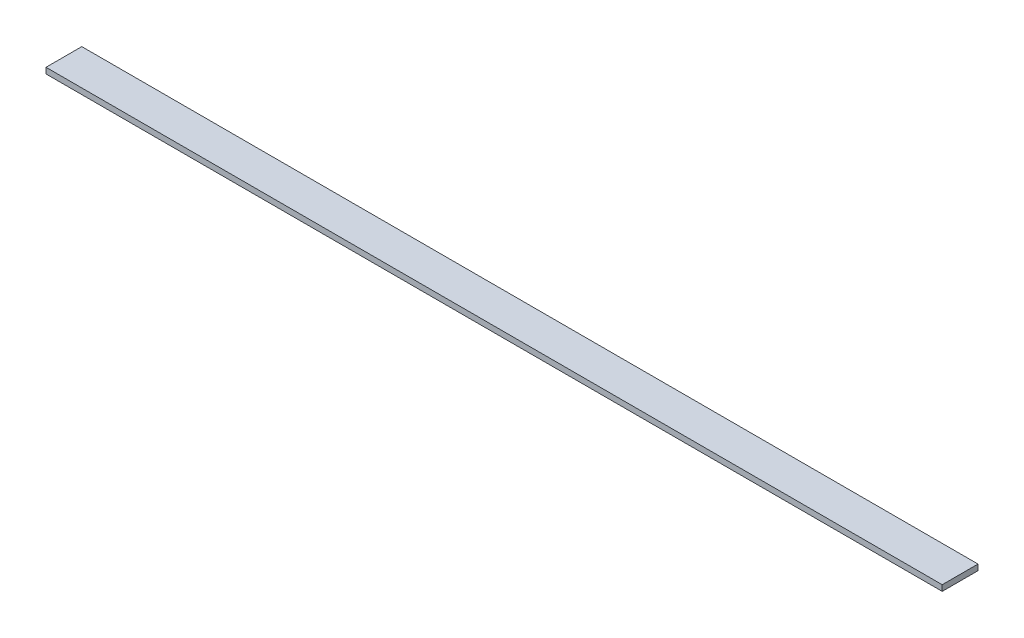
ISO-10303-21;
HEADER;
FILE_DESCRIPTION(('STEP AP214'),'2;1');
FILE_NAME('part.step','',(''),(''),'','','');
FILE_SCHEMA(('AUTOMOTIVE_DESIGN { 1 0 10303 214 1 1 1 1 }'));
ENDSEC;
DATA;
#1=APPLICATION_CONTEXT('core data for automotive mechanical design processes');
#2=APPLICATION_PROTOCOL_DEFINITION('international standard','automotive_design',2000,#1);
#3=PRODUCT_CONTEXT('',#1,'mechanical');
#4=PRODUCT('Part','Part','',(#3));
#5=PRODUCT_RELATED_PRODUCT_CATEGORY('part','',(#4));
#6=PRODUCT_DEFINITION_FORMATION('','',#4);
#7=PRODUCT_DEFINITION_CONTEXT('part definition',#1,'design');
#8=PRODUCT_DEFINITION('design','',#6,#7);
#9=PRODUCT_DEFINITION_SHAPE('','',#8);
#10=(LENGTH_UNIT() NAMED_UNIT(*) SI_UNIT(.MILLI.,.METRE.));
#11=(NAMED_UNIT(*) PLANE_ANGLE_UNIT() SI_UNIT($,.RADIAN.));
#12=(NAMED_UNIT(*) SI_UNIT($,.STERADIAN.) SOLID_ANGLE_UNIT());
#13=UNCERTAINTY_MEASURE_WITH_UNIT(LENGTH_MEASURE(1.E-05),#10,'distance_accuracy_value','');
#14=(GEOMETRIC_REPRESENTATION_CONTEXT(3) GLOBAL_UNCERTAINTY_ASSIGNED_CONTEXT((#13)) GLOBAL_UNIT_ASSIGNED_CONTEXT((#10,
#11,#12)) REPRESENTATION_CONTEXT('',''));
#15=CARTESIAN_POINT('',(0.,0.,0.));
#16=DIRECTION('',(0.,0.,1.));
#17=DIRECTION('',(1.,0.,0.));
#18=AXIS2_PLACEMENT_3D('',#15,#16,#17);
#19=CARTESIAN_POINT('',(-3811.4111111111,38.1,-1664.22916666666));
#20=DIRECTION('',(1.,0.,0.));
#21=DIRECTION('',(0.,0.,-0.999999999999999));
#22=AXIS2_PLACEMENT_3D('',#19,#20,#21);
#23=PLANE('',#22);
#24=DIRECTION('',(0.,0.,0.999999999999999));
#25=VECTOR('',#24,1.);
#26=CARTESIAN_POINT('',(-3811.4111111111,0.,-1664.22916666666));
#27=LINE('',#26,#25);
#28=CARTESIAN_POINT('',(-3811.4111111111,0.,-1664.22916666666));
#29=VERTEX_POINT('',#28);
#30=CARTESIAN_POINT('',(-3811.4111111111,0.,-1429.27916666666));
#31=VERTEX_POINT('',#30);
#32=EDGE_CURVE('E94',#29,#31,#27,.T.);
#33=ORIENTED_EDGE('',*,*,#32,.T.);
#34=DIRECTION('',(0.,-1.,0.));
#35=VECTOR('',#34,1.);
#36=CARTESIAN_POINT('',(-3811.4111111111,38.1,-1429.27916666666));
#37=LINE('',#36,#35);
#38=CARTESIAN_POINT('',(-3811.4111111111,38.1,-1429.27916666666));
#39=VERTEX_POINT('',#38);
#40=EDGE_CURVE('E11',#39,#31,#37,.T.);
#41=ORIENTED_EDGE('',*,*,#40,.F.);
#42=DIRECTION('',(0.,0.,0.999999999999999));
#43=VECTOR('',#42,1.);
#44=CARTESIAN_POINT('',(-3811.4111111111,38.1,-1664.22916666666));
#45=LINE('',#44,#43);
#46=CARTESIAN_POINT('',(-3811.4111111111,38.1,-1664.22916666666));
#47=VERTEX_POINT('',#46);
#48=EDGE_CURVE('E82',#47,#39,#45,.T.);
#49=ORIENTED_EDGE('',*,*,#48,.F.);
#50=DIRECTION('',(0.,-1.,0.));
#51=VECTOR('',#50,1.);
#52=CARTESIAN_POINT('',(-3811.4111111111,38.1,-1664.22916666666));
#53=LINE('',#52,#51);
#54=EDGE_CURVE('E90',#47,#29,#53,.T.);
#55=ORIENTED_EDGE('',*,*,#54,.T.);
#56=EDGE_LOOP('',(#33,#41,#49,#55));
#57=FACE_BOUND('',#56,.T.);
#58=ADVANCED_FACE('F31',(#57),#23,.F.);
#59=CARTESIAN_POINT('',(-3811.4111111111,38.1,-1429.27916666666));
#60=DIRECTION('',(0.,0.,-0.999999999999999));
#61=DIRECTION('',(-1.,0.,0.));
#62=AXIS2_PLACEMENT_3D('',#59,#60,#61);
#63=PLANE('',#62);
#64=DIRECTION('',(1.,0.,0.));
#65=VECTOR('',#64,1.);
#66=CARTESIAN_POINT('',(-3811.4111111111,0.,-1429.27916666666));
#67=LINE('',#66,#65);
#68=CARTESIAN_POINT('',(2071.8638888889,0.,-1429.27916666666));
#69=VERTEX_POINT('',#68);
#70=EDGE_CURVE('E86',#31,#69,#67,.T.);
#71=ORIENTED_EDGE('',*,*,#70,.T.);
#72=DIRECTION('',(0.,-1.,0.));
#73=VECTOR('',#72,1.);
#74=CARTESIAN_POINT('',(2071.8638888889,38.1,-1429.27916666666));
#75=LINE('',#74,#73);
#76=CARTESIAN_POINT('',(2071.8638888889,38.1,-1429.27916666666));
#77=VERTEX_POINT('',#76);
#78=EDGE_CURVE('E39',#77,#69,#75,.T.);
#79=ORIENTED_EDGE('',*,*,#78,.F.);
#80=DIRECTION('',(1.,0.,0.));
#81=VECTOR('',#80,1.);
#82=CARTESIAN_POINT('',(-3811.4111111111,38.1,-1429.27916666666));
#83=LINE('',#82,#81);
#84=EDGE_CURVE('E77',#39,#77,#83,.T.);
#85=ORIENTED_EDGE('',*,*,#84,.F.);
#86=ORIENTED_EDGE('',*,*,#40,.T.);
#87=EDGE_LOOP('',(#71,#79,#85,#86));
#88=FACE_BOUND('',#87,.T.);
#89=ADVANCED_FACE('F85',(#88),#63,.F.);
#90=CARTESIAN_POINT('',(2071.8638888889,38.1,-1664.22916666666));
#91=DIRECTION('',(-1.,0.,0.));
#92=DIRECTION('',(0.,0.,0.999999999999999));
#93=AXIS2_PLACEMENT_3D('',#90,#91,#92);
#94=PLANE('',#93);
#95=DIRECTION('',(0.,0.,-0.999999999999999));
#96=VECTOR('',#95,1.);
#97=CARTESIAN_POINT('',(2071.8638888889,0.,-1664.22916666666));
#98=LINE('',#97,#96);
#99=CARTESIAN_POINT('',(2071.8638888889,0.,-1664.22916666666));
#100=VERTEX_POINT('',#99);
#101=EDGE_CURVE('E64',#69,#100,#98,.T.);
#102=ORIENTED_EDGE('',*,*,#101,.T.);
#103=DIRECTION('',(0.,-1.,0.));
#104=VECTOR('',#103,1.);
#105=CARTESIAN_POINT('',(2071.8638888889,38.1,-1664.22916666666));
#106=LINE('',#105,#104);
#107=CARTESIAN_POINT('',(2071.8638888889,38.1,-1664.22916666666));
#108=VERTEX_POINT('',#107);
#109=EDGE_CURVE('E87',#108,#100,#106,.T.);
#110=ORIENTED_EDGE('',*,*,#109,.F.);
#111=DIRECTION('',(0.,0.,-0.999999999999999));
#112=VECTOR('',#111,1.);
#113=CARTESIAN_POINT('',(2071.8638888889,38.1,-1664.22916666666));
#114=LINE('',#113,#112);
#115=EDGE_CURVE('E80',#77,#108,#114,.T.);
#116=ORIENTED_EDGE('',*,*,#115,.F.);
#117=ORIENTED_EDGE('',*,*,#78,.T.);
#118=EDGE_LOOP('',(#102,#110,#116,#117));
#119=FACE_BOUND('',#118,.T.);
#120=ADVANCED_FACE('F88',(#119),#94,.F.);
#121=CARTESIAN_POINT('',(-3811.4111111111,38.1,-1664.22916666666));
#122=DIRECTION('',(0.,0.,0.999999999999999));
#123=DIRECTION('',(1.,0.,0.));
#124=AXIS2_PLACEMENT_3D('',#121,#122,#123);
#125=PLANE('',#124);
#126=DIRECTION('',(-1.,0.,0.));
#127=VECTOR('',#126,1.);
#128=CARTESIAN_POINT('',(-3811.4111111111,0.,-1664.22916666666));
#129=LINE('',#128,#127);
#130=EDGE_CURVE('E70',#100,#29,#129,.T.);
#131=ORIENTED_EDGE('',*,*,#130,.T.);
#132=ORIENTED_EDGE('',*,*,#54,.F.);
#133=DIRECTION('',(-1.,0.,0.));
#134=VECTOR('',#133,1.);
#135=CARTESIAN_POINT('',(-3811.4111111111,38.1,-1664.22916666666));
#136=LINE('',#135,#134);
#137=EDGE_CURVE('E47',#108,#47,#136,.T.);
#138=ORIENTED_EDGE('',*,*,#137,.F.);
#139=ORIENTED_EDGE('',*,*,#109,.T.);
#140=EDGE_LOOP('',(#131,#132,#138,#139));
#141=FACE_BOUND('',#140,.T.);
#142=ADVANCED_FACE('F101',(#141),#125,.F.);
#143=CARTESIAN_POINT('',(0.,38.1,8.88178419700125E-13));
#144=DIRECTION('',(0.,1.,0.));
#145=DIRECTION('',(0.,0.,0.999999999999999));
#146=AXIS2_PLACEMENT_3D('',#143,#144,#145);
#147=PLANE('',#146);
#148=ORIENTED_EDGE('',*,*,#48,.T.);
#149=ORIENTED_EDGE('',*,*,#84,.T.);
#150=ORIENTED_EDGE('',*,*,#115,.T.);
#151=ORIENTED_EDGE('',*,*,#137,.T.);
#152=EDGE_LOOP('',(#148,#149,#150,#151));
#153=FACE_BOUND('',#152,.T.);
#154=ADVANCED_FACE('F78',(#153),#147,.T.);
#155=CARTESIAN_POINT('',(0.,0.,0.));
#156=DIRECTION('',(0.,1.,0.));
#157=DIRECTION('',(0.,0.,0.999999999999999));
#158=AXIS2_PLACEMENT_3D('',#155,#156,#157);
#159=PLANE('',#158);
#160=ORIENTED_EDGE('',*,*,#32,.F.);
#161=ORIENTED_EDGE('',*,*,#130,.F.);
#162=ORIENTED_EDGE('',*,*,#101,.F.);
#163=ORIENTED_EDGE('',*,*,#70,.F.);
#164=EDGE_LOOP('',(#160,#161,#162,#163));
#165=FACE_BOUND('',#164,.T.);
#166=ADVANCED_FACE('F104',(#165),#159,.F.);
#167=CLOSED_SHELL('',(#58,#89,#120,#142,#154,#166));
#168=MANIFOLD_SOLID_BREP('B2',#167);
#169=ADVANCED_BREP_SHAPE_REPRESENTATION('',(#18,#168),#14);
#170=SHAPE_DEFINITION_REPRESENTATION(#9,#169);
ENDSEC;
END-ISO-10303-21;
